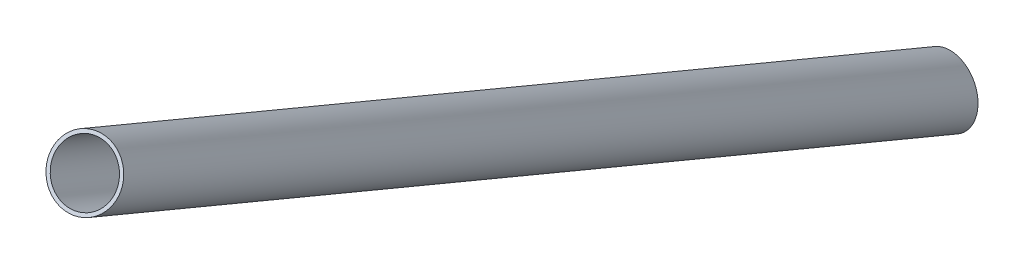
ISO-10303-21;
HEADER;
FILE_DESCRIPTION(('STEP AP214'),'2;1');
FILE_NAME('part.step','',(''),(''),'','','');
FILE_SCHEMA(('AUTOMOTIVE_DESIGN { 1 0 10303 214 1 1 1 1 }'));
ENDSEC;
DATA;
#1=APPLICATION_CONTEXT('core data for automotive mechanical design processes');
#2=APPLICATION_PROTOCOL_DEFINITION('international standard','automotive_design',2000,#1);
#3=PRODUCT_CONTEXT('',#1,'mechanical');
#4=PRODUCT('Part','Part','',(#3));
#5=PRODUCT_RELATED_PRODUCT_CATEGORY('part','',(#4));
#6=PRODUCT_DEFINITION_FORMATION('','',#4);
#7=PRODUCT_DEFINITION_CONTEXT('part definition',#1,'design');
#8=PRODUCT_DEFINITION('design','',#6,#7);
#9=PRODUCT_DEFINITION_SHAPE('','',#8);
#10=(LENGTH_UNIT() NAMED_UNIT(*) SI_UNIT(.MILLI.,.METRE.));
#11=(NAMED_UNIT(*) PLANE_ANGLE_UNIT() SI_UNIT($,.RADIAN.));
#12=(NAMED_UNIT(*) SI_UNIT($,.STERADIAN.) SOLID_ANGLE_UNIT());
#13=UNCERTAINTY_MEASURE_WITH_UNIT(LENGTH_MEASURE(1.E-05),#10,'distance_accuracy_value','');
#14=(GEOMETRIC_REPRESENTATION_CONTEXT(3) GLOBAL_UNCERTAINTY_ASSIGNED_CONTEXT((#13)) GLOBAL_UNIT_ASSIGNED_CONTEXT((#10,
#11,#12)) REPRESENTATION_CONTEXT('',''));
#15=CARTESIAN_POINT('',(0.,0.,0.));
#16=DIRECTION('',(0.,0.,1.));
#17=DIRECTION('',(1.,0.,0.));
#18=AXIS2_PLACEMENT_3D('',#15,#16,#17);
#19=CARTESIAN_POINT('',(225.,200.,-450.000000000001));
#20=DIRECTION('',(-0.173785333909048,-0.463427557090794,-0.868926669545238));
#21=DIRECTION('',(0.,0.882352941176471,-0.470588235294118));
#22=AXIS2_PLACEMENT_3D('',#19,#20,#21);
#23=CYLINDRICAL_SURFACE('',#22,9.79999999999998);
#24=CARTESIAN_POINT('',(225.,200.,-450.000000000001));
#25=DIRECTION('',(0.173785333909048,0.463427557090794,0.868926669545238));
#26=DIRECTION('',(-0.0231066302686451,-0.880191131181345,0.474056596017113));
#27=AXIS2_PLACEMENT_3D('',#24,#25,#26);
#28=CIRCLE('',#27,9.79999999999998);
#29=CARTESIAN_POINT('',(224.773555023367,191.374126914423,-445.354245359033));
#30=VERTEX_POINT('',#29);
#31=EDGE_CURVE('E53',#30,#30,#28,.T.);
#32=ORIENTED_EDGE('',*,*,#31,.T.);
#33=EDGE_LOOP('',(#32));
#34=FACE_BOUND('',#33,.T.);
#35=CARTESIAN_POINT('',(150.,4.9960036108132E-13,-825.));
#36=DIRECTION('',(0.0197141066523152,-0.0461644942318042,-0.998739302055958));
#37=DIRECTION('',(-0.412111349099456,-0.910500714966001,0.0339512001235188));
#38=AXIS2_PLACEMENT_3D('',#35,#36,#37);
#39=ELLIPSE('',#38,11.0634568180166,9.79999999999998);
#40=CARTESIAN_POINT('',(145.440623885023,-10.0732853427991,-824.624382363514));
#41=VERTEX_POINT('',#40);
#42=EDGE_CURVE('E43',#41,#41,#39,.T.);
#43=ORIENTED_EDGE('',*,*,#42,.T.);
#44=EDGE_LOOP('',(#43));
#45=FACE_BOUND('',#44,.T.);
#46=ADVANCED_FACE('F39',(#34,#45),#23,.F.);
#47=CARTESIAN_POINT('',(225.,200.,-450.000000000001));
#48=DIRECTION('',(-0.173785333909048,-0.463427557090794,-0.868926669545238));
#49=DIRECTION('',(0.,0.882352941176471,-0.470588235294118));
#50=AXIS2_PLACEMENT_3D('',#47,#48,#49);
#51=CYLINDRICAL_SURFACE('',#50,11.);
#52=CARTESIAN_POINT('',(225.,200.,-450.000000000001));
#53=DIRECTION('',(0.173785333909048,0.463427557090794,0.868926669545238));
#54=DIRECTION('',(-0.0231066302686451,-0.880191131181345,0.474056596017113));
#55=AXIS2_PLACEMENT_3D('',#52,#53,#54);
#56=CIRCLE('',#55,11.);
#57=CARTESIAN_POINT('',(224.745827067045,190.317897557005,-444.785377443812));
#58=VERTEX_POINT('',#57);
#59=EDGE_CURVE('E47',#58,#58,#56,.T.);
#60=ORIENTED_EDGE('',*,*,#59,.F.);
#61=EDGE_LOOP('',(#60));
#62=FACE_BOUND('',#61,.T.);
#63=CARTESIAN_POINT('',(150.,4.9960036108132E-13,-825.));
#64=DIRECTION('',(0.0197141066523152,-0.0461644942318042,-0.998739302055958));
#65=DIRECTION('',(-0.412111349099456,-0.910500714966001,0.0339512001235188));
#66=AXIS2_PLACEMENT_3D('',#63,#64,#65);
#67=ELLIPSE('',#66,12.4181658161411,11.);
#68=CARTESIAN_POINT('',(144.882332932169,-11.3067488541623,-824.578388367209));
#69=VERTEX_POINT('',#68);
#70=EDGE_CURVE('E10',#69,#69,#67,.T.);
#71=ORIENTED_EDGE('',*,*,#70,.F.);
#72=EDGE_LOOP('',(#71));
#73=FACE_BOUND('',#72,.T.);
#74=ADVANCED_FACE('F67',(#62,#73),#51,.T.);
#75=CARTESIAN_POINT('',(225.,200.,-450.000000000001));
#76=DIRECTION('',(0.173785333909048,0.463427557090794,0.868926669545238));
#77=DIRECTION('',(-0.0231066302686451,-0.880191131181345,0.474056596017113));
#78=AXIS2_PLACEMENT_3D('',#75,#76,#77);
#79=PLANE('',#78);
#80=ORIENTED_EDGE('',*,*,#31,.F.);
#81=EDGE_LOOP('',(#80));
#82=FACE_BOUND('',#81,.T.);
#83=ORIENTED_EDGE('',*,*,#59,.T.);
#84=EDGE_LOOP('',(#83));
#85=FACE_BOUND('',#84,.T.);
#86=ADVANCED_FACE('F62',(#82,#85),#79,.T.);
#87=CARTESIAN_POINT('',(150.,0.,-825.));
#88=DIRECTION('',(0.0197141066523152,-0.0461644942318042,-0.998739302055958));
#89=DIRECTION('',(0.,0.998933436662963,-0.0461734676705452));
#90=AXIS2_PLACEMENT_3D('',#87,#88,#89);
#91=PLANE('',#90);
#92=ORIENTED_EDGE('',*,*,#42,.F.);
#93=EDGE_LOOP('',(#92));
#94=FACE_BOUND('',#93,.T.);
#95=ORIENTED_EDGE('',*,*,#70,.T.);
#96=EDGE_LOOP('',(#95));
#97=FACE_BOUND('',#96,.T.);
#98=ADVANCED_FACE('F41',(#94,#97),#91,.T.);
#99=CLOSED_SHELL('',(#46,#74,#86,#98));
#100=MANIFOLD_SOLID_BREP('B2',#99);
#101=ADVANCED_BREP_SHAPE_REPRESENTATION('',(#18,#100),#14);
#102=SHAPE_DEFINITION_REPRESENTATION(#9,#101);
ENDSEC;
END-ISO-10303-21;
